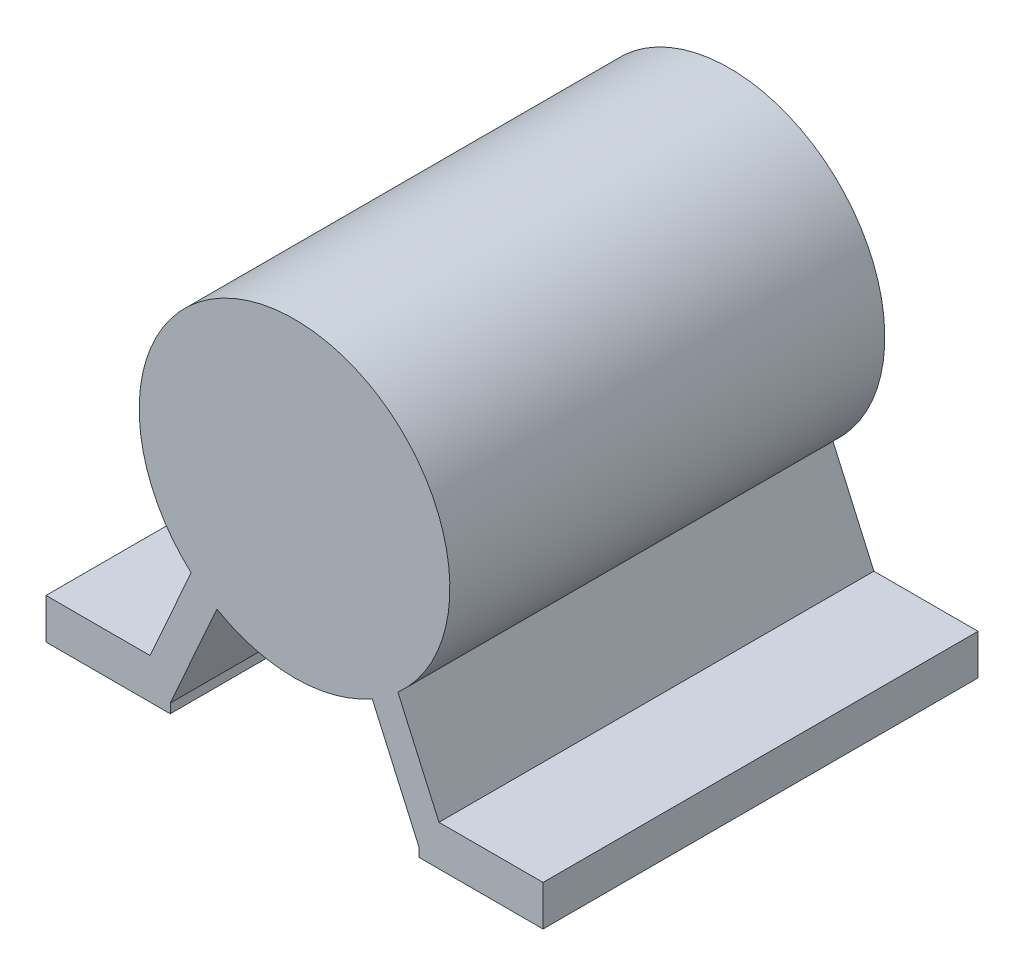
ISO-10303-21;
HEADER;
FILE_DESCRIPTION(('STEP AP214'),'2;1');
FILE_NAME('part.step','',(''),(''),'','','');
FILE_SCHEMA(('AUTOMOTIVE_DESIGN { 1 0 10303 214 1 1 1 1 }'));
ENDSEC;
DATA;
#1=APPLICATION_CONTEXT('core data for automotive mechanical design processes');
#2=APPLICATION_PROTOCOL_DEFINITION('international standard','automotive_design',2000,#1);
#3=PRODUCT_CONTEXT('',#1,'mechanical');
#4=PRODUCT('Part','Part','',(#3));
#5=PRODUCT_RELATED_PRODUCT_CATEGORY('part','',(#4));
#6=PRODUCT_DEFINITION_FORMATION('','',#4);
#7=PRODUCT_DEFINITION_CONTEXT('part definition',#1,'design');
#8=PRODUCT_DEFINITION('design','',#6,#7);
#9=PRODUCT_DEFINITION_SHAPE('','',#8);
#10=(LENGTH_UNIT() NAMED_UNIT(*) SI_UNIT(.MILLI.,.METRE.));
#11=(NAMED_UNIT(*) PLANE_ANGLE_UNIT() SI_UNIT($,.RADIAN.));
#12=(NAMED_UNIT(*) SI_UNIT($,.STERADIAN.) SOLID_ANGLE_UNIT());
#13=UNCERTAINTY_MEASURE_WITH_UNIT(LENGTH_MEASURE(1.E-05),#10,'distance_accuracy_value','');
#14=(GEOMETRIC_REPRESENTATION_CONTEXT(3) GLOBAL_UNCERTAINTY_ASSIGNED_CONTEXT((#13)) GLOBAL_UNIT_ASSIGNED_CONTEXT((#10,
#11,#12)) REPRESENTATION_CONTEXT('',''));
#15=CARTESIAN_POINT('',(0.,0.,0.));
#16=DIRECTION('',(0.,0.,1.));
#17=DIRECTION('',(1.,0.,0.));
#18=AXIS2_PLACEMENT_3D('',#15,#16,#17);
#19=CARTESIAN_POINT('',(0.,0.,140.));
#20=DIRECTION('',(0.,0.,-1.));
#21=DIRECTION('',(-1.,0.,0.));
#22=AXIS2_PLACEMENT_3D('',#19,#20,#21);
#23=CYLINDRICAL_SURFACE('',#22,50.);
#24=CARTESIAN_POINT('',(0.,0.,0.));
#25=DIRECTION('',(0.,0.,1.));
#26=DIRECTION('',(1.,0.,0.));
#27=AXIS2_PLACEMENT_3D('',#24,#25,#26);
#28=CIRCLE('',#27,50.);
#29=CARTESIAN_POINT('',(33.2810766375342,-37.3144735705406,0.));
#30=VERTEX_POINT('',#29);
#31=CARTESIAN_POINT('',(-33.2810766375342,-37.3144735705406,0.));
#32=VERTEX_POINT('',#31);
#33=EDGE_CURVE('E180',#30,#32,#28,.T.);
#34=ORIENTED_EDGE('',*,*,#33,.T.);
#35=DIRECTION('',(0.,0.,-1.));
#36=VECTOR('',#35,1.);
#37=CARTESIAN_POINT('',(-33.2810766375342,-37.3144735705406,140.));
#38=LINE('',#37,#36);
#39=CARTESIAN_POINT('',(-33.2810766375342,-37.3144735705406,140.));
#40=VERTEX_POINT('',#39);
#41=EDGE_CURVE('E11',#40,#32,#38,.T.);
#42=ORIENTED_EDGE('',*,*,#41,.F.);
#43=CARTESIAN_POINT('',(0.,0.,140.));
#44=DIRECTION('',(0.,0.,1.));
#45=DIRECTION('',(1.,0.,0.));
#46=AXIS2_PLACEMENT_3D('',#43,#44,#45);
#47=CIRCLE('',#46,50.);
#48=CARTESIAN_POINT('',(33.2810766375342,-37.3144735705406,140.));
#49=VERTEX_POINT('',#48);
#50=EDGE_CURVE('E220',#49,#40,#47,.T.);
#51=ORIENTED_EDGE('',*,*,#50,.F.);
#52=DIRECTION('',(0.,0.,-1.));
#53=VECTOR('',#52,1.);
#54=CARTESIAN_POINT('',(33.2810766375342,-37.3144735705406,140.));
#55=LINE('',#54,#53);
#56=EDGE_CURVE('E176',#49,#30,#55,.T.);
#57=ORIENTED_EDGE('',*,*,#56,.T.);
#58=EDGE_LOOP('',(#34,#42,#51,#57));
#59=FACE_BOUND('',#58,.T.);
#60=ADVANCED_FACE('F43',(#59),#23,.T.);
#61=CARTESIAN_POINT('',(-46.4947170014945,-67.,140.));
#62=DIRECTION('',(0.913582133014481,-0.406654258844921,0.));
#63=DIRECTION('',(0.406654258844921,0.913582133014481,0.));
#64=AXIS2_PLACEMENT_3D('',#61,#62,#63);
#65=PLANE('',#64);
#66=DIRECTION('',(-0.406654258844921,-0.913582133014481,0.));
#67=VECTOR('',#66,1.);
#68=CARTESIAN_POINT('',(-46.4947170014945,-67.,0.));
#69=LINE('',#68,#67);
#70=CARTESIAN_POINT('',(-46.4947170014945,-67.,0.));
#71=VERTEX_POINT('',#70);
#72=EDGE_CURVE('E184',#32,#71,#69,.T.);
#73=ORIENTED_EDGE('',*,*,#72,.T.);
#74=DIRECTION('',(0.,0.,-1.));
#75=VECTOR('',#74,1.);
#76=CARTESIAN_POINT('',(-46.4947170014945,-67.,140.));
#77=LINE('',#76,#75);
#78=CARTESIAN_POINT('',(-46.4947170014945,-67.,140.));
#79=VERTEX_POINT('',#78);
#80=EDGE_CURVE('E52',#79,#71,#77,.T.);
#81=ORIENTED_EDGE('',*,*,#80,.F.);
#82=DIRECTION('',(-0.406654258844921,-0.913582133014481,0.));
#83=VECTOR('',#82,1.);
#84=CARTESIAN_POINT('',(-46.4947170014945,-67.,140.));
#85=LINE('',#84,#83);
#86=EDGE_CURVE('E121',#40,#79,#85,.T.);
#87=ORIENTED_EDGE('',*,*,#86,.F.);
#88=ORIENTED_EDGE('',*,*,#41,.T.);
#89=EDGE_LOOP('',(#73,#81,#87,#88));
#90=FACE_BOUND('',#89,.T.);
#91=ADVANCED_FACE('F328',(#90),#65,.F.);
#92=CARTESIAN_POINT('',(-80.,-67.,140.));
#93=DIRECTION('',(0.,-1.,0.));
#94=DIRECTION('',(0.,0.,-1.));
#95=AXIS2_PLACEMENT_3D('',#92,#93,#94);
#96=PLANE('',#95);
#97=DIRECTION('',(-1.,0.,0.));
#98=VECTOR('',#97,1.);
#99=CARTESIAN_POINT('',(-80.,-67.,0.));
#100=LINE('',#99,#98);
#101=CARTESIAN_POINT('',(-80.,-67.,0.));
#102=VERTEX_POINT('',#101);
#103=EDGE_CURVE('E187',#71,#102,#100,.T.);
#104=ORIENTED_EDGE('',*,*,#103,.T.);
#105=DIRECTION('',(0.,0.,-1.));
#106=VECTOR('',#105,1.);
#107=CARTESIAN_POINT('',(-80.,-67.,140.));
#108=LINE('',#107,#106);
#109=CARTESIAN_POINT('',(-80.,-67.,140.));
#110=VERTEX_POINT('',#109);
#111=EDGE_CURVE('E255',#110,#102,#108,.T.);
#112=ORIENTED_EDGE('',*,*,#111,.F.);
#113=DIRECTION('',(-1.,0.,0.));
#114=VECTOR('',#113,1.);
#115=CARTESIAN_POINT('',(-80.,-67.,140.));
#116=LINE('',#115,#114);
#117=EDGE_CURVE('E265',#79,#110,#116,.T.);
#118=ORIENTED_EDGE('',*,*,#117,.F.);
#119=ORIENTED_EDGE('',*,*,#80,.T.);
#120=EDGE_LOOP('',(#104,#112,#118,#119));
#121=FACE_BOUND('',#120,.T.);
#122=ADVANCED_FACE('F263',(#121),#96,.F.);
#123=CARTESIAN_POINT('',(-80.,-80.,140.));
#124=DIRECTION('',(1.,0.,0.));
#125=DIRECTION('',(0.,0.,-1.));
#126=AXIS2_PLACEMENT_3D('',#123,#124,#125);
#127=PLANE('',#126);
#128=DIRECTION('',(0.,-1.,0.));
#129=VECTOR('',#128,1.);
#130=CARTESIAN_POINT('',(-80.,-80.,0.));
#131=LINE('',#130,#129);
#132=CARTESIAN_POINT('',(-80.,-80.,0.));
#133=VERTEX_POINT('',#132);
#134=EDGE_CURVE('E190',#102,#133,#131,.T.);
#135=ORIENTED_EDGE('',*,*,#134,.T.);
#136=DIRECTION('',(0.,0.,-1.));
#137=VECTOR('',#136,1.);
#138=CARTESIAN_POINT('',(-80.,-80.,140.));
#139=LINE('',#138,#137);
#140=CARTESIAN_POINT('',(-80.,-80.,140.));
#141=VERTEX_POINT('',#140);
#142=EDGE_CURVE('E251',#141,#133,#139,.T.);
#143=ORIENTED_EDGE('',*,*,#142,.F.);
#144=DIRECTION('',(0.,-1.,0.));
#145=VECTOR('',#144,1.);
#146=CARTESIAN_POINT('',(-80.,-80.,140.));
#147=LINE('',#146,#145);
#148=EDGE_CURVE('E284',#110,#141,#147,.T.);
#149=ORIENTED_EDGE('',*,*,#148,.F.);
#150=ORIENTED_EDGE('',*,*,#111,.T.);
#151=EDGE_LOOP('',(#135,#143,#149,#150));
#152=FACE_BOUND('',#151,.T.);
#153=ADVANCED_FACE('F274',(#152),#127,.F.);
#154=CARTESIAN_POINT('',(-40.,-80.,140.));
#155=DIRECTION('',(0.,1.,0.));
#156=DIRECTION('',(0.,0.,1.));
#157=AXIS2_PLACEMENT_3D('',#154,#155,#156);
#158=PLANE('',#157);
#159=DIRECTION('',(1.,0.,0.));
#160=VECTOR('',#159,1.);
#161=CARTESIAN_POINT('',(-40.,-80.,0.));
#162=LINE('',#161,#160);
#163=CARTESIAN_POINT('',(-40.,-80.,0.));
#164=VERTEX_POINT('',#163);
#165=EDGE_CURVE('E193',#133,#164,#162,.T.);
#166=ORIENTED_EDGE('',*,*,#165,.T.);
#167=DIRECTION('',(0.,0.,-1.));
#168=VECTOR('',#167,1.);
#169=CARTESIAN_POINT('',(-40.,-80.,140.));
#170=LINE('',#169,#168);
#171=CARTESIAN_POINT('',(-40.,-80.,140.));
#172=VERTEX_POINT('',#171);
#173=EDGE_CURVE('E247',#172,#164,#170,.T.);
#174=ORIENTED_EDGE('',*,*,#173,.F.);
#175=DIRECTION('',(1.,0.,0.));
#176=VECTOR('',#175,1.);
#177=CARTESIAN_POINT('',(-40.,-80.,140.));
#178=LINE('',#177,#176);
#179=EDGE_CURVE('E280',#141,#172,#178,.T.);
#180=ORIENTED_EDGE('',*,*,#179,.F.);
#181=ORIENTED_EDGE('',*,*,#142,.T.);
#182=EDGE_LOOP('',(#166,#174,#180,#181));
#183=FACE_BOUND('',#182,.T.);
#184=ADVANCED_FACE('F278',(#183),#158,.F.);
#185=CARTESIAN_POINT('',(-40.,-77.,140.));
#186=DIRECTION('',(-1.,0.,0.));
#187=DIRECTION('',(0.,0.,1.));
#188=AXIS2_PLACEMENT_3D('',#185,#186,#187);
#189=PLANE('',#188);
#190=DIRECTION('',(0.,1.,0.));
#191=VECTOR('',#190,1.);
#192=CARTESIAN_POINT('',(-40.,-77.,0.));
#193=LINE('',#192,#191);
#194=CARTESIAN_POINT('',(-40.,-77.,0.));
#195=VERTEX_POINT('',#194);
#196=EDGE_CURVE('E196',#164,#195,#193,.T.);
#197=ORIENTED_EDGE('',*,*,#196,.T.);
#198=DIRECTION('',(0.,0.,-1.));
#199=VECTOR('',#198,1.);
#200=CARTESIAN_POINT('',(-40.,-77.,140.));
#201=LINE('',#200,#199);
#202=CARTESIAN_POINT('',(-40.,-77.,140.));
#203=VERTEX_POINT('',#202);
#204=EDGE_CURVE('E243',#203,#195,#201,.T.);
#205=ORIENTED_EDGE('',*,*,#204,.F.);
#206=DIRECTION('',(0.,1.,0.));
#207=VECTOR('',#206,1.);
#208=CARTESIAN_POINT('',(-40.,-77.,140.));
#209=LINE('',#208,#207);
#210=EDGE_CURVE('E283',#172,#203,#209,.T.);
#211=ORIENTED_EDGE('',*,*,#210,.F.);
#212=ORIENTED_EDGE('',*,*,#173,.T.);
#213=EDGE_LOOP('',(#197,#205,#211,#212));
#214=FACE_BOUND('',#213,.T.);
#215=ADVANCED_FACE('F341',(#214),#189,.F.);
#216=CARTESIAN_POINT('',(-40.,-77.,140.));
#217=DIRECTION('',(-0.91358213301448,0.406654258844921,0.));
#218=DIRECTION('',(-0.406654258844921,-0.913582133014481,0.));
#219=AXIS2_PLACEMENT_3D('',#216,#217,#218);
#220=PLANE('',#219);
#221=DIRECTION('',(0.406654258844921,0.913582133014481,0.));
#222=VECTOR('',#221,1.);
#223=CARTESIAN_POINT('',(-40.,-77.,0.));
#224=LINE('',#223,#222);
#225=CARTESIAN_POINT('',(-25.,-43.3012701892219,0.));
#226=VERTEX_POINT('',#225);
#227=EDGE_CURVE('E199',#195,#226,#224,.T.);
#228=ORIENTED_EDGE('',*,*,#227,.T.);
#229=DIRECTION('',(0.,0.,-1.));
#230=VECTOR('',#229,1.);
#231=CARTESIAN_POINT('',(-25.,-43.3012701892219,140.));
#232=LINE('',#231,#230);
#233=CARTESIAN_POINT('',(-25.,-43.3012701892219,140.));
#234=VERTEX_POINT('',#233);
#235=EDGE_CURVE('E239',#234,#226,#232,.T.);
#236=ORIENTED_EDGE('',*,*,#235,.F.);
#237=DIRECTION('',(0.406654258844921,0.913582133014481,0.));
#238=VECTOR('',#237,1.);
#239=CARTESIAN_POINT('',(-40.,-77.,140.));
#240=LINE('',#239,#238);
#241=EDGE_CURVE('E288',#203,#234,#240,.T.);
#242=ORIENTED_EDGE('',*,*,#241,.F.);
#243=ORIENTED_EDGE('',*,*,#204,.T.);
#244=EDGE_LOOP('',(#228,#236,#242,#243));
#245=FACE_BOUND('',#244,.T.);
#246=ADVANCED_FACE('F344',(#245),#220,.F.);
#247=CARTESIAN_POINT('',(0.,0.,140.));
#248=DIRECTION('',(0.,0.,-1.));
#249=DIRECTION('',(-1.,0.,0.));
#250=AXIS2_PLACEMENT_3D('',#247,#248,#249);
#251=CYLINDRICAL_SURFACE('',#250,50.);
#252=CARTESIAN_POINT('',(0.,0.,0.));
#253=DIRECTION('',(0.,0.,1.));
#254=DIRECTION('',(1.,0.,0.));
#255=AXIS2_PLACEMENT_3D('',#252,#253,#254);
#256=CIRCLE('',#255,50.);
#257=CARTESIAN_POINT('',(25.,-43.3012701892219,0.));
#258=VERTEX_POINT('',#257);
#259=EDGE_CURVE('E202',#226,#258,#256,.T.);
#260=ORIENTED_EDGE('',*,*,#259,.T.);
#261=DIRECTION('',(0.,0.,-1.));
#262=VECTOR('',#261,1.);
#263=CARTESIAN_POINT('',(25.,-43.3012701892219,140.));
#264=LINE('',#263,#262);
#265=CARTESIAN_POINT('',(25.,-43.3012701892219,140.));
#266=VERTEX_POINT('',#265);
#267=EDGE_CURVE('E235',#266,#258,#264,.T.);
#268=ORIENTED_EDGE('',*,*,#267,.F.);
#269=CARTESIAN_POINT('',(0.,0.,140.));
#270=DIRECTION('',(0.,0.,1.));
#271=DIRECTION('',(1.,0.,0.));
#272=AXIS2_PLACEMENT_3D('',#269,#270,#271);
#273=CIRCLE('',#272,50.);
#274=EDGE_CURVE('E295',#234,#266,#273,.T.);
#275=ORIENTED_EDGE('',*,*,#274,.F.);
#276=ORIENTED_EDGE('',*,*,#235,.T.);
#277=EDGE_LOOP('',(#260,#268,#275,#276));
#278=FACE_BOUND('',#277,.T.);
#279=ADVANCED_FACE('F348',(#278),#251,.T.);
#280=CARTESIAN_POINT('',(40.,-77.,140.));
#281=DIRECTION('',(0.91358213301448,0.406654258844922,0.));
#282=DIRECTION('',(-0.406654258844922,0.91358213301448,0.));
#283=AXIS2_PLACEMENT_3D('',#280,#281,#282);
#284=PLANE('',#283);
#285=DIRECTION('',(0.406654258844922,-0.91358213301448,0.));
#286=VECTOR('',#285,1.);
#287=CARTESIAN_POINT('',(40.,-77.,0.));
#288=LINE('',#287,#286);
#289=CARTESIAN_POINT('',(40.,-77.,0.));
#290=VERTEX_POINT('',#289);
#291=EDGE_CURVE('E205',#258,#290,#288,.T.);
#292=ORIENTED_EDGE('',*,*,#291,.T.);
#293=DIRECTION('',(0.,0.,-1.));
#294=VECTOR('',#293,1.);
#295=CARTESIAN_POINT('',(40.,-77.,140.));
#296=LINE('',#295,#294);
#297=CARTESIAN_POINT('',(40.,-77.,140.));
#298=VERTEX_POINT('',#297);
#299=EDGE_CURVE('E231',#298,#290,#296,.T.);
#300=ORIENTED_EDGE('',*,*,#299,.F.);
#301=DIRECTION('',(0.406654258844922,-0.91358213301448,0.));
#302=VECTOR('',#301,1.);
#303=CARTESIAN_POINT('',(40.,-77.,140.));
#304=LINE('',#303,#302);
#305=EDGE_CURVE('E298',#266,#298,#304,.T.);
#306=ORIENTED_EDGE('',*,*,#305,.F.);
#307=ORIENTED_EDGE('',*,*,#267,.T.);
#308=EDGE_LOOP('',(#292,#300,#306,#307));
#309=FACE_BOUND('',#308,.T.);
#310=ADVANCED_FACE('F352',(#309),#284,.F.);
#311=CARTESIAN_POINT('',(40.,-77.,140.));
#312=DIRECTION('',(1.,0.,0.));
#313=DIRECTION('',(0.,0.,-1.));
#314=AXIS2_PLACEMENT_3D('',#311,#312,#313);
#315=PLANE('',#314);
#316=DIRECTION('',(0.,-1.,0.));
#317=VECTOR('',#316,1.);
#318=CARTESIAN_POINT('',(40.,-77.,0.));
#319=LINE('',#318,#317);
#320=CARTESIAN_POINT('',(40.,-80.,0.));
#321=VERTEX_POINT('',#320);
#322=EDGE_CURVE('E208',#290,#321,#319,.T.);
#323=ORIENTED_EDGE('',*,*,#322,.T.);
#324=DIRECTION('',(0.,0.,-1.));
#325=VECTOR('',#324,1.);
#326=CARTESIAN_POINT('',(40.,-80.,140.));
#327=LINE('',#326,#325);
#328=CARTESIAN_POINT('',(40.,-80.,140.));
#329=VERTEX_POINT('',#328);
#330=EDGE_CURVE('E227',#329,#321,#327,.T.);
#331=ORIENTED_EDGE('',*,*,#330,.F.);
#332=DIRECTION('',(0.,-1.,0.));
#333=VECTOR('',#332,1.);
#334=CARTESIAN_POINT('',(40.,-77.,140.));
#335=LINE('',#334,#333);
#336=EDGE_CURVE('E301',#298,#329,#335,.T.);
#337=ORIENTED_EDGE('',*,*,#336,.F.);
#338=ORIENTED_EDGE('',*,*,#299,.T.);
#339=EDGE_LOOP('',(#323,#331,#337,#338));
#340=FACE_BOUND('',#339,.T.);
#341=ADVANCED_FACE('F309',(#340),#315,.F.);
#342=CARTESIAN_POINT('',(40.,-80.,140.));
#343=DIRECTION('',(0.,1.,0.));
#344=DIRECTION('',(0.,0.,1.));
#345=AXIS2_PLACEMENT_3D('',#342,#343,#344);
#346=PLANE('',#345);
#347=DIRECTION('',(1.,0.,0.));
#348=VECTOR('',#347,1.);
#349=CARTESIAN_POINT('',(40.,-80.,0.));
#350=LINE('',#349,#348);
#351=CARTESIAN_POINT('',(80.,-80.,0.));
#352=VERTEX_POINT('',#351);
#353=EDGE_CURVE('E211',#321,#352,#350,.T.);
#354=ORIENTED_EDGE('',*,*,#353,.T.);
#355=DIRECTION('',(0.,0.,-1.));
#356=VECTOR('',#355,1.);
#357=CARTESIAN_POINT('',(80.,-80.,140.));
#358=LINE('',#357,#356);
#359=CARTESIAN_POINT('',(80.,-80.,140.));
#360=VERTEX_POINT('',#359);
#361=EDGE_CURVE('E169',#360,#352,#358,.T.);
#362=ORIENTED_EDGE('',*,*,#361,.F.);
#363=DIRECTION('',(1.,0.,0.));
#364=VECTOR('',#363,1.);
#365=CARTESIAN_POINT('',(40.,-80.,140.));
#366=LINE('',#365,#364);
#367=EDGE_CURVE('E158',#329,#360,#366,.T.);
#368=ORIENTED_EDGE('',*,*,#367,.F.);
#369=ORIENTED_EDGE('',*,*,#330,.T.);
#370=EDGE_LOOP('',(#354,#362,#368,#369));
#371=FACE_BOUND('',#370,.T.);
#372=ADVANCED_FACE('F313',(#371),#346,.F.);
#373=CARTESIAN_POINT('',(80.,-80.,140.));
#374=DIRECTION('',(-1.,0.,0.));
#375=DIRECTION('',(0.,0.,1.));
#376=AXIS2_PLACEMENT_3D('',#373,#374,#375);
#377=PLANE('',#376);
#378=DIRECTION('',(0.,1.,0.));
#379=VECTOR('',#378,1.);
#380=CARTESIAN_POINT('',(80.,-80.,0.));
#381=LINE('',#380,#379);
#382=CARTESIAN_POINT('',(80.,-67.,0.));
#383=VERTEX_POINT('',#382);
#384=EDGE_CURVE('E167',#352,#383,#381,.T.);
#385=ORIENTED_EDGE('',*,*,#384,.T.);
#386=DIRECTION('',(0.,0.,-1.));
#387=VECTOR('',#386,1.);
#388=CARTESIAN_POINT('',(80.,-67.,140.));
#389=LINE('',#388,#387);
#390=CARTESIAN_POINT('',(80.,-67.,140.));
#391=VERTEX_POINT('',#390);
#392=EDGE_CURVE('E164',#391,#383,#389,.T.);
#393=ORIENTED_EDGE('',*,*,#392,.F.);
#394=DIRECTION('',(0.,1.,0.));
#395=VECTOR('',#394,1.);
#396=CARTESIAN_POINT('',(80.,-80.,140.));
#397=LINE('',#396,#395);
#398=EDGE_CURVE('E152',#360,#391,#397,.T.);
#399=ORIENTED_EDGE('',*,*,#398,.F.);
#400=ORIENTED_EDGE('',*,*,#361,.T.);
#401=EDGE_LOOP('',(#385,#393,#399,#400));
#402=FACE_BOUND('',#401,.T.);
#403=ADVANCED_FACE('F165',(#402),#377,.F.);
#404=CARTESIAN_POINT('',(80.,-67.,140.));
#405=DIRECTION('',(0.,-1.,0.));
#406=DIRECTION('',(0.,0.,-1.));
#407=AXIS2_PLACEMENT_3D('',#404,#405,#406);
#408=PLANE('',#407);
#409=DIRECTION('',(-1.,0.,0.));
#410=VECTOR('',#409,1.);
#411=CARTESIAN_POINT('',(80.,-67.,0.));
#412=LINE('',#411,#410);
#413=CARTESIAN_POINT('',(46.4947170014945,-67.,0.));
#414=VERTEX_POINT('',#413);
#415=EDGE_CURVE('E107',#383,#414,#412,.T.);
#416=ORIENTED_EDGE('',*,*,#415,.T.);
#417=DIRECTION('',(0.,0.,-1.));
#418=VECTOR('',#417,1.);
#419=CARTESIAN_POINT('',(46.4947170014945,-67.,140.));
#420=LINE('',#419,#418);
#421=CARTESIAN_POINT('',(46.4947170014945,-67.,140.));
#422=VERTEX_POINT('',#421);
#423=EDGE_CURVE('E170',#422,#414,#420,.T.);
#424=ORIENTED_EDGE('',*,*,#423,.F.);
#425=DIRECTION('',(-1.,0.,0.));
#426=VECTOR('',#425,1.);
#427=CARTESIAN_POINT('',(80.,-67.,140.));
#428=LINE('',#427,#426);
#429=EDGE_CURVE('E156',#391,#422,#428,.T.);
#430=ORIENTED_EDGE('',*,*,#429,.F.);
#431=ORIENTED_EDGE('',*,*,#392,.T.);
#432=EDGE_LOOP('',(#416,#424,#430,#431));
#433=FACE_BOUND('',#432,.T.);
#434=ADVANCED_FACE('F172',(#433),#408,.F.);
#435=CARTESIAN_POINT('',(46.4947170014945,-67.,140.));
#436=DIRECTION('',(-0.913582133014481,-0.406654258844921,0.));
#437=DIRECTION('',(0.406654258844921,-0.913582133014481,0.));
#438=AXIS2_PLACEMENT_3D('',#435,#436,#437);
#439=PLANE('',#438);
#440=DIRECTION('',(-0.406654258844921,0.91358213301448,0.));
#441=VECTOR('',#440,1.);
#442=CARTESIAN_POINT('',(46.4947170014945,-67.,0.));
#443=LINE('',#442,#441);
#444=EDGE_CURVE('E113',#414,#30,#443,.T.);
#445=ORIENTED_EDGE('',*,*,#444,.T.);
#446=ORIENTED_EDGE('',*,*,#56,.F.);
#447=DIRECTION('',(-0.406654258844921,0.91358213301448,0.));
#448=VECTOR('',#447,1.);
#449=CARTESIAN_POINT('',(46.4947170014945,-67.,140.));
#450=LINE('',#449,#448);
#451=EDGE_CURVE('E60',#422,#49,#450,.T.);
#452=ORIENTED_EDGE('',*,*,#451,.F.);
#453=ORIENTED_EDGE('',*,*,#423,.T.);
#454=EDGE_LOOP('',(#445,#446,#452,#453));
#455=FACE_BOUND('',#454,.T.);
#456=ADVANCED_FACE('F317',(#455),#439,.F.);
#457=CARTESIAN_POINT('',(0.,0.,140.));
#458=DIRECTION('',(0.,0.,1.));
#459=DIRECTION('',(1.,0.,0.));
#460=AXIS2_PLACEMENT_3D('',#457,#458,#459);
#461=PLANE('',#460);
#462=ORIENTED_EDGE('',*,*,#50,.T.);
#463=ORIENTED_EDGE('',*,*,#86,.T.);
#464=ORIENTED_EDGE('',*,*,#117,.T.);
#465=ORIENTED_EDGE('',*,*,#148,.T.);
#466=ORIENTED_EDGE('',*,*,#179,.T.);
#467=ORIENTED_EDGE('',*,*,#210,.T.);
#468=ORIENTED_EDGE('',*,*,#241,.T.);
#469=ORIENTED_EDGE('',*,*,#274,.T.);
#470=ORIENTED_EDGE('',*,*,#305,.T.);
#471=ORIENTED_EDGE('',*,*,#336,.T.);
#472=ORIENTED_EDGE('',*,*,#367,.T.);
#473=ORIENTED_EDGE('',*,*,#398,.T.);
#474=ORIENTED_EDGE('',*,*,#429,.T.);
#475=ORIENTED_EDGE('',*,*,#451,.T.);
#476=EDGE_LOOP('',(#462,#463,#464,#465,#466,#467,#468,#469,#470,#471,#472,#473,#474,#475));
#477=FACE_BOUND('',#476,.T.);
#478=ADVANCED_FACE('F154',(#477),#461,.T.);
#479=CARTESIAN_POINT('',(0.,0.,0.));
#480=DIRECTION('',(0.,0.,1.));
#481=DIRECTION('',(1.,0.,0.));
#482=AXIS2_PLACEMENT_3D('',#479,#480,#481);
#483=PLANE('',#482);
#484=ORIENTED_EDGE('',*,*,#33,.F.);
#485=ORIENTED_EDGE('',*,*,#444,.F.);
#486=ORIENTED_EDGE('',*,*,#415,.F.);
#487=ORIENTED_EDGE('',*,*,#384,.F.);
#488=ORIENTED_EDGE('',*,*,#353,.F.);
#489=ORIENTED_EDGE('',*,*,#322,.F.);
#490=ORIENTED_EDGE('',*,*,#291,.F.);
#491=ORIENTED_EDGE('',*,*,#259,.F.);
#492=ORIENTED_EDGE('',*,*,#227,.F.);
#493=ORIENTED_EDGE('',*,*,#196,.F.);
#494=ORIENTED_EDGE('',*,*,#165,.F.);
#495=ORIENTED_EDGE('',*,*,#134,.F.);
#496=ORIENTED_EDGE('',*,*,#103,.F.);
#497=ORIENTED_EDGE('',*,*,#72,.F.);
#498=EDGE_LOOP('',(#484,#485,#486,#487,#488,#489,#490,#491,#492,#493,#494,#495,#496,#497));
#499=FACE_BOUND('',#498,.T.);
#500=ADVANCED_FACE('F269',(#499),#483,.F.);
#501=CLOSED_SHELL('',(#60,#91,#122,#153,#184,#215,#246,#279,#310,#341,#372,#403,#434,#456,#478,#500));
#502=MANIFOLD_SOLID_BREP('B2',#501);
#503=ADVANCED_BREP_SHAPE_REPRESENTATION('',(#18,#502),#14);
#504=SHAPE_DEFINITION_REPRESENTATION(#9,#503);
ENDSEC;
END-ISO-10303-21;
